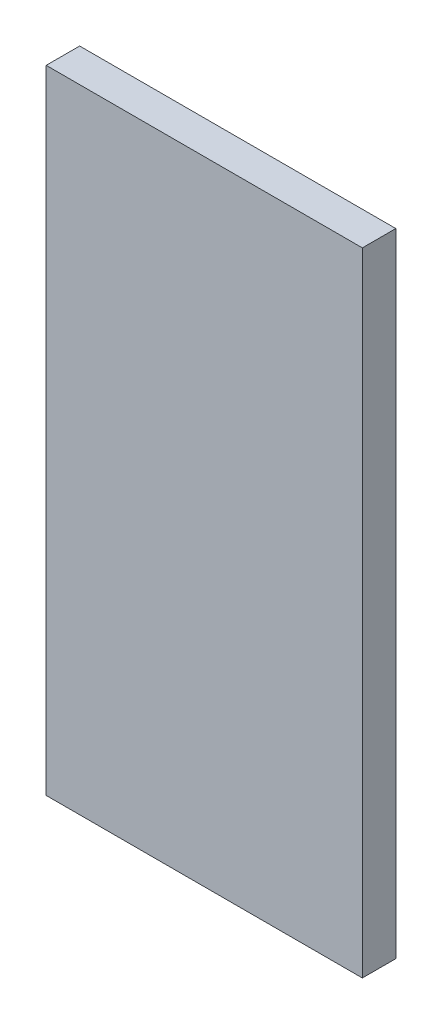
ISO-10303-21;
HEADER;
FILE_DESCRIPTION(('STEP AP214'),'2;1');
FILE_NAME('part.step','',(''),(''),'','','');
FILE_SCHEMA(('AUTOMOTIVE_DESIGN { 1 0 10303 214 1 1 1 1 }'));
ENDSEC;
DATA;
#1=APPLICATION_CONTEXT('core data for automotive mechanical design processes');
#2=APPLICATION_PROTOCOL_DEFINITION('international standard','automotive_design',2000,#1);
#3=PRODUCT_CONTEXT('',#1,'mechanical');
#4=PRODUCT('Part','Part','',(#3));
#5=PRODUCT_RELATED_PRODUCT_CATEGORY('part','',(#4));
#6=PRODUCT_DEFINITION_FORMATION('','',#4);
#7=PRODUCT_DEFINITION_CONTEXT('part definition',#1,'design');
#8=PRODUCT_DEFINITION('design','',#6,#7);
#9=PRODUCT_DEFINITION_SHAPE('','',#8);
#10=(LENGTH_UNIT() NAMED_UNIT(*) SI_UNIT(.MILLI.,.METRE.));
#11=(NAMED_UNIT(*) PLANE_ANGLE_UNIT() SI_UNIT($,.RADIAN.));
#12=(NAMED_UNIT(*) SI_UNIT($,.STERADIAN.) SOLID_ANGLE_UNIT());
#13=UNCERTAINTY_MEASURE_WITH_UNIT(LENGTH_MEASURE(1.E-05),#10,'distance_accuracy_value','');
#14=(GEOMETRIC_REPRESENTATION_CONTEXT(3) GLOBAL_UNCERTAINTY_ASSIGNED_CONTEXT((#13)) GLOBAL_UNIT_ASSIGNED_CONTEXT((#10,
#11,#12)) REPRESENTATION_CONTEXT('',''));
#15=CARTESIAN_POINT('',(0.,0.,0.));
#16=DIRECTION('',(0.,0.,1.));
#17=DIRECTION('',(1.,0.,0.));
#18=AXIS2_PLACEMENT_3D('',#15,#16,#17);
#19=CARTESIAN_POINT('',(7.5,-15.,0.79375));
#20=DIRECTION('',(-1.,0.,0.));
#21=DIRECTION('',(0.,0.,1.));
#22=AXIS2_PLACEMENT_3D('',#19,#20,#21);
#23=PLANE('',#22);
#24=DIRECTION('',(0.,1.,0.));
#25=VECTOR('',#24,1.);
#26=CARTESIAN_POINT('',(7.5,-15.,-0.79375));
#27=LINE('',#26,#25);
#28=CARTESIAN_POINT('',(7.5,-15.,-0.79375));
#29=VERTEX_POINT('',#28);
#30=CARTESIAN_POINT('',(7.5,15.,-0.79375));
#31=VERTEX_POINT('',#30);
#32=EDGE_CURVE('E98',#29,#31,#27,.T.);
#33=ORIENTED_EDGE('',*,*,#32,.T.);
#34=DIRECTION('',(0.,0.,-1.));
#35=VECTOR('',#34,1.);
#36=CARTESIAN_POINT('',(7.5,15.,0.79375));
#37=LINE('',#36,#35);
#38=CARTESIAN_POINT('',(7.5,15.,0.79375));
#39=VERTEX_POINT('',#38);
#40=EDGE_CURVE('E11',#39,#31,#37,.T.);
#41=ORIENTED_EDGE('',*,*,#40,.F.);
#42=DIRECTION('',(0.,1.,0.));
#43=VECTOR('',#42,1.);
#44=CARTESIAN_POINT('',(7.5,-15.,0.79375));
#45=LINE('',#44,#43);
#46=CARTESIAN_POINT('',(7.5,-15.,0.79375));
#47=VERTEX_POINT('',#46);
#48=EDGE_CURVE('E86',#47,#39,#45,.T.);
#49=ORIENTED_EDGE('',*,*,#48,.F.);
#50=DIRECTION('',(0.,0.,-1.));
#51=VECTOR('',#50,1.);
#52=CARTESIAN_POINT('',(7.5,-15.,0.79375));
#53=LINE('',#52,#51);
#54=EDGE_CURVE('E94',#47,#29,#53,.T.);
#55=ORIENTED_EDGE('',*,*,#54,.T.);
#56=EDGE_LOOP('',(#33,#41,#49,#55));
#57=FACE_BOUND('',#56,.T.);
#58=ADVANCED_FACE('F35',(#57),#23,.F.);
#59=CARTESIAN_POINT('',(-7.5,15.,0.79375));
#60=DIRECTION('',(0.,-1.,0.));
#61=DIRECTION('',(0.,0.,-1.));
#62=AXIS2_PLACEMENT_3D('',#59,#60,#61);
#63=PLANE('',#62);
#64=DIRECTION('',(-1.,0.,0.));
#65=VECTOR('',#64,1.);
#66=CARTESIAN_POINT('',(-7.5,15.,-0.79375));
#67=LINE('',#66,#65);
#68=CARTESIAN_POINT('',(-7.5,15.,-0.79375));
#69=VERTEX_POINT('',#68);
#70=EDGE_CURVE('E90',#31,#69,#67,.T.);
#71=ORIENTED_EDGE('',*,*,#70,.T.);
#72=DIRECTION('',(0.,0.,-1.));
#73=VECTOR('',#72,1.);
#74=CARTESIAN_POINT('',(-7.5,15.,0.79375));
#75=LINE('',#74,#73);
#76=CARTESIAN_POINT('',(-7.5,15.,0.79375));
#77=VERTEX_POINT('',#76);
#78=EDGE_CURVE('E43',#77,#69,#75,.T.);
#79=ORIENTED_EDGE('',*,*,#78,.F.);
#80=DIRECTION('',(-1.,0.,0.));
#81=VECTOR('',#80,1.);
#82=CARTESIAN_POINT('',(-7.5,15.,0.79375));
#83=LINE('',#82,#81);
#84=EDGE_CURVE('E81',#39,#77,#83,.T.);
#85=ORIENTED_EDGE('',*,*,#84,.F.);
#86=ORIENTED_EDGE('',*,*,#40,.T.);
#87=EDGE_LOOP('',(#71,#79,#85,#86));
#88=FACE_BOUND('',#87,.T.);
#89=ADVANCED_FACE('F89',(#88),#63,.F.);
#90=CARTESIAN_POINT('',(-7.5,-15.,0.79375));
#91=DIRECTION('',(1.,0.,0.));
#92=DIRECTION('',(0.,0.,-1.));
#93=AXIS2_PLACEMENT_3D('',#90,#91,#92);
#94=PLANE('',#93);
#95=DIRECTION('',(0.,-1.,0.));
#96=VECTOR('',#95,1.);
#97=CARTESIAN_POINT('',(-7.5,-15.,-0.79375));
#98=LINE('',#97,#96);
#99=CARTESIAN_POINT('',(-7.5,-15.,-0.79375));
#100=VERTEX_POINT('',#99);
#101=EDGE_CURVE('E68',#69,#100,#98,.T.);
#102=ORIENTED_EDGE('',*,*,#101,.T.);
#103=DIRECTION('',(0.,0.,-1.));
#104=VECTOR('',#103,1.);
#105=CARTESIAN_POINT('',(-7.5,-15.,0.79375));
#106=LINE('',#105,#104);
#107=CARTESIAN_POINT('',(-7.5,-15.,0.79375));
#108=VERTEX_POINT('',#107);
#109=EDGE_CURVE('E91',#108,#100,#106,.T.);
#110=ORIENTED_EDGE('',*,*,#109,.F.);
#111=DIRECTION('',(0.,-1.,0.));
#112=VECTOR('',#111,1.);
#113=CARTESIAN_POINT('',(-7.5,-15.,0.79375));
#114=LINE('',#113,#112);
#115=EDGE_CURVE('E84',#77,#108,#114,.T.);
#116=ORIENTED_EDGE('',*,*,#115,.F.);
#117=ORIENTED_EDGE('',*,*,#78,.T.);
#118=EDGE_LOOP('',(#102,#110,#116,#117));
#119=FACE_BOUND('',#118,.T.);
#120=ADVANCED_FACE('F92',(#119),#94,.F.);
#121=CARTESIAN_POINT('',(-7.5,-15.,0.79375));
#122=DIRECTION('',(0.,1.,0.));
#123=DIRECTION('',(0.,0.,1.));
#124=AXIS2_PLACEMENT_3D('',#121,#122,#123);
#125=PLANE('',#124);
#126=DIRECTION('',(1.,0.,0.));
#127=VECTOR('',#126,1.);
#128=CARTESIAN_POINT('',(-7.5,-15.,-0.79375));
#129=LINE('',#128,#127);
#130=EDGE_CURVE('E74',#100,#29,#129,.T.);
#131=ORIENTED_EDGE('',*,*,#130,.T.);
#132=ORIENTED_EDGE('',*,*,#54,.F.);
#133=DIRECTION('',(1.,0.,0.));
#134=VECTOR('',#133,1.);
#135=CARTESIAN_POINT('',(-7.5,-15.,0.79375));
#136=LINE('',#135,#134);
#137=EDGE_CURVE('E51',#108,#47,#136,.T.);
#138=ORIENTED_EDGE('',*,*,#137,.F.);
#139=ORIENTED_EDGE('',*,*,#109,.T.);
#140=EDGE_LOOP('',(#131,#132,#138,#139));
#141=FACE_BOUND('',#140,.T.);
#142=ADVANCED_FACE('F105',(#141),#125,.F.);
#143=CARTESIAN_POINT('',(0.,0.,0.79375));
#144=DIRECTION('',(0.,0.,-1.));
#145=DIRECTION('',(-1.,0.,0.));
#146=AXIS2_PLACEMENT_3D('',#143,#144,#145);
#147=PLANE('',#146);
#148=ORIENTED_EDGE('',*,*,#48,.T.);
#149=ORIENTED_EDGE('',*,*,#84,.T.);
#150=ORIENTED_EDGE('',*,*,#115,.T.);
#151=ORIENTED_EDGE('',*,*,#137,.T.);
#152=EDGE_LOOP('',(#148,#149,#150,#151));
#153=FACE_BOUND('',#152,.T.);
#154=ADVANCED_FACE('F82',(#153),#147,.F.);
#155=CARTESIAN_POINT('',(0.,0.,-0.79375));
#156=DIRECTION('',(0.,0.,-1.));
#157=DIRECTION('',(-1.,0.,0.));
#158=AXIS2_PLACEMENT_3D('',#155,#156,#157);
#159=PLANE('',#158);
#160=ORIENTED_EDGE('',*,*,#32,.F.);
#161=ORIENTED_EDGE('',*,*,#130,.F.);
#162=ORIENTED_EDGE('',*,*,#101,.F.);
#163=ORIENTED_EDGE('',*,*,#70,.F.);
#164=EDGE_LOOP('',(#160,#161,#162,#163));
#165=FACE_BOUND('',#164,.T.);
#166=ADVANCED_FACE('F108',(#165),#159,.T.);
#167=CLOSED_SHELL('',(#58,#89,#120,#142,#154,#166));
#168=MANIFOLD_SOLID_BREP('B2',#167);
#169=ADVANCED_BREP_SHAPE_REPRESENTATION('',(#18,#168),#14);
#170=SHAPE_DEFINITION_REPRESENTATION(#9,#169);
ENDSEC;
END-ISO-10303-21;
